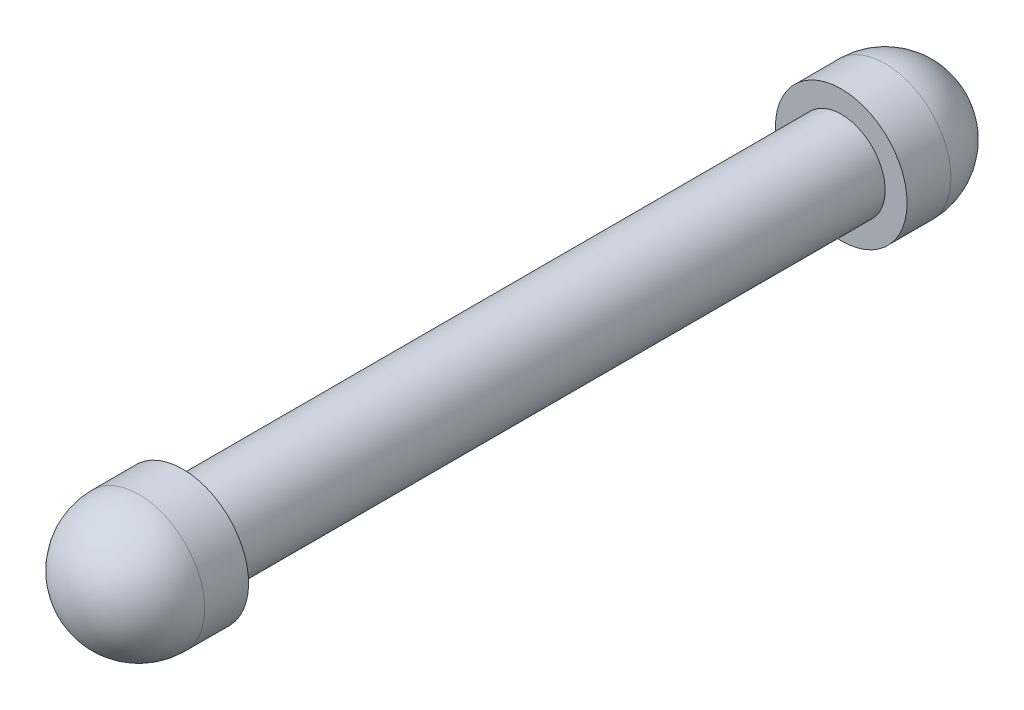
ISO-10303-21;
HEADER;
FILE_DESCRIPTION(('STEP AP214'),'2;1');
FILE_NAME('part.step','',(''),(''),'','','');
FILE_SCHEMA(('AUTOMOTIVE_DESIGN { 1 0 10303 214 1 1 1 1 }'));
ENDSEC;
DATA;
#1=APPLICATION_CONTEXT('core data for automotive mechanical design processes');
#2=APPLICATION_PROTOCOL_DEFINITION('international standard','automotive_design',2000,#1);
#3=PRODUCT_CONTEXT('',#1,'mechanical');
#4=PRODUCT('Part','Part','',(#3));
#5=PRODUCT_RELATED_PRODUCT_CATEGORY('part','',(#4));
#6=PRODUCT_DEFINITION_FORMATION('','',#4);
#7=PRODUCT_DEFINITION_CONTEXT('part definition',#1,'design');
#8=PRODUCT_DEFINITION('design','',#6,#7);
#9=PRODUCT_DEFINITION_SHAPE('','',#8);
#10=(LENGTH_UNIT() NAMED_UNIT(*) SI_UNIT(.MILLI.,.METRE.));
#11=(NAMED_UNIT(*) PLANE_ANGLE_UNIT() SI_UNIT($,.RADIAN.));
#12=(NAMED_UNIT(*) SI_UNIT($,.STERADIAN.) SOLID_ANGLE_UNIT());
#13=UNCERTAINTY_MEASURE_WITH_UNIT(LENGTH_MEASURE(1.E-05),#10,'distance_accuracy_value','');
#14=(GEOMETRIC_REPRESENTATION_CONTEXT(3) GLOBAL_UNCERTAINTY_ASSIGNED_CONTEXT((#13)) GLOBAL_UNIT_ASSIGNED_CONTEXT((#10,
#11,#12)) REPRESENTATION_CONTEXT('',''));
#15=CARTESIAN_POINT('',(0.,0.,0.));
#16=DIRECTION('',(0.,0.,1.));
#17=DIRECTION('',(1.,0.,0.));
#18=AXIS2_PLACEMENT_3D('',#15,#16,#17);
#19=CARTESIAN_POINT('',(0.,0.,14.999999972));
#20=DIRECTION('',(0.,0.,-1.));
#21=DIRECTION('',(0.,1.,0.));
#22=AXIS2_PLACEMENT_3D('',#19,#20,#21);
#23=CYLINDRICAL_SURFACE('',#22,2.);
#24=CARTESIAN_POINT('',(0.,0.,-14.999999972));
#25=DIRECTION('',(0.,0.,-1.));
#26=DIRECTION('',(0.,1.,0.));
#27=AXIS2_PLACEMENT_3D('',#24,#25,#26);
#28=CIRCLE('',#27,2.);
#29=CARTESIAN_POINT('',(0.,2.00000000000001,-14.999999972));
#30=VERTEX_POINT('',#29);
#31=EDGE_CURVE('E62',#30,#30,#28,.T.);
#32=ORIENTED_EDGE('',*,*,#31,.F.);
#33=EDGE_LOOP('',(#32));
#34=FACE_BOUND('',#33,.T.);
#35=CARTESIAN_POINT('',(0.,0.,14.999999972));
#36=DIRECTION('',(0.,0.,-1.));
#37=DIRECTION('',(0.,1.,0.));
#38=AXIS2_PLACEMENT_3D('',#35,#36,#37);
#39=CIRCLE('',#38,2.);
#40=CARTESIAN_POINT('',(0.,2.,14.999999972));
#41=VERTEX_POINT('',#40);
#42=EDGE_CURVE('E70',#41,#41,#39,.T.);
#43=ORIENTED_EDGE('',*,*,#42,.T.);
#44=EDGE_LOOP('',(#43));
#45=FACE_BOUND('',#44,.T.);
#46=ADVANCED_FACE('F49',(#34,#45),#23,.T.);
#47=CARTESIAN_POINT('',(0.,0.,-19.999999972));
#48=DIRECTION('',(0.,0.,1.));
#49=DIRECTION('',(0.,-1.,0.));
#50=AXIS2_PLACEMENT_3D('',#47,#48,#49);
#51=CYLINDRICAL_SURFACE('',#50,3.);
#52=CARTESIAN_POINT('',(0.,0.,-16.999999972));
#53=DIRECTION('',(0.,0.,1.));
#54=DIRECTION('',(0.,-1.,0.));
#55=AXIS2_PLACEMENT_3D('',#52,#53,#54);
#56=CIRCLE('',#55,3.);
#57=CARTESIAN_POINT('',(0.,-3.,-16.999999972));
#58=VERTEX_POINT('',#57);
#59=EDGE_CURVE('E57',#58,#58,#56,.T.);
#60=ORIENTED_EDGE('',*,*,#59,.T.);
#61=EDGE_LOOP('',(#60));
#62=FACE_BOUND('',#61,.T.);
#63=CARTESIAN_POINT('',(0.,0.,-14.999999972));
#64=DIRECTION('',(0.,0.,-1.));
#65=DIRECTION('',(0.,1.,0.));
#66=AXIS2_PLACEMENT_3D('',#63,#64,#65);
#67=CIRCLE('',#66,3.);
#68=CARTESIAN_POINT('',(0.,3.,-14.999999972));
#69=VERTEX_POINT('',#68);
#70=EDGE_CURVE('E67',#69,#69,#67,.T.);
#71=ORIENTED_EDGE('',*,*,#70,.T.);
#72=EDGE_LOOP('',(#71));
#73=FACE_BOUND('',#72,.T.);
#74=ADVANCED_FACE('F98',(#62,#73),#51,.T.);
#75=CARTESIAN_POINT('',(0.,0.,-14.999999972));
#76=DIRECTION('',(0.,0.,-1.));
#77=DIRECTION('',(0.,1.,0.));
#78=AXIS2_PLACEMENT_3D('',#75,#76,#77);
#79=PLANE('',#78);
#80=ORIENTED_EDGE('',*,*,#31,.T.);
#81=EDGE_LOOP('',(#80));
#82=FACE_BOUND('',#81,.T.);
#83=ORIENTED_EDGE('',*,*,#70,.F.);
#84=EDGE_LOOP('',(#83));
#85=FACE_BOUND('',#84,.T.);
#86=ADVANCED_FACE('F94',(#82,#85),#79,.F.);
#87=CARTESIAN_POINT('',(0.,0.,-16.999999972));
#88=DIRECTION('',(0.,0.,-1.));
#89=DIRECTION('',(0.,1.,0.));
#90=AXIS2_PLACEMENT_3D('',#87,#88,#89);
#91=SPHERICAL_SURFACE('',#90,3.);
#92=ORIENTED_EDGE('',*,*,#59,.F.);
#93=EDGE_LOOP('',(#92));
#94=FACE_BOUND('',#93,.T.);
#95=ADVANCED_FACE('F86',(#94),#91,.T.);
#96=CARTESIAN_POINT('',(0.,0.,19.999999972));
#97=DIRECTION('',(0.,0.,-1.));
#98=DIRECTION('',(0.,1.,0.));
#99=AXIS2_PLACEMENT_3D('',#96,#97,#98);
#100=CYLINDRICAL_SURFACE('',#99,3.);
#101=CARTESIAN_POINT('',(0.,0.,16.999999972));
#102=DIRECTION('',(0.,0.,-1.));
#103=DIRECTION('',(0.,1.,0.));
#104=AXIS2_PLACEMENT_3D('',#101,#102,#103);
#105=CIRCLE('',#104,3.);
#106=CARTESIAN_POINT('',(0.,3.,16.999999972));
#107=VERTEX_POINT('',#106);
#108=EDGE_CURVE('E11',#107,#107,#105,.T.);
#109=ORIENTED_EDGE('',*,*,#108,.T.);
#110=EDGE_LOOP('',(#109));
#111=FACE_BOUND('',#110,.T.);
#112=CARTESIAN_POINT('',(0.,0.,14.999999972));
#113=DIRECTION('',(0.,0.,-1.));
#114=DIRECTION('',(0.,1.,0.));
#115=AXIS2_PLACEMENT_3D('',#112,#113,#114);
#116=CIRCLE('',#115,3.);
#117=CARTESIAN_POINT('',(0.,3.,14.999999972));
#118=VERTEX_POINT('',#117);
#119=EDGE_CURVE('E74',#118,#118,#116,.T.);
#120=ORIENTED_EDGE('',*,*,#119,.F.);
#121=EDGE_LOOP('',(#120));
#122=FACE_BOUND('',#121,.T.);
#123=ADVANCED_FACE('F84',(#111,#122),#100,.T.);
#124=CARTESIAN_POINT('',(0.,0.,14.999999972));
#125=DIRECTION('',(0.,0.,1.));
#126=DIRECTION('',(0.,1.,0.));
#127=AXIS2_PLACEMENT_3D('',#124,#125,#126);
#128=PLANE('',#127);
#129=ORIENTED_EDGE('',*,*,#42,.F.);
#130=EDGE_LOOP('',(#129));
#131=FACE_BOUND('',#130,.T.);
#132=ORIENTED_EDGE('',*,*,#119,.T.);
#133=EDGE_LOOP('',(#132));
#134=FACE_BOUND('',#133,.T.);
#135=ADVANCED_FACE('F82',(#131,#134),#128,.F.);
#136=CARTESIAN_POINT('',(0.,0.,16.999999972));
#137=DIRECTION('',(0.,0.,1.));
#138=DIRECTION('',(0.,-1.,0.));
#139=AXIS2_PLACEMENT_3D('',#136,#137,#138);
#140=SPHERICAL_SURFACE('',#139,3.);
#141=ORIENTED_EDGE('',*,*,#108,.F.);
#142=EDGE_LOOP('',(#141));
#143=FACE_BOUND('',#142,.T.);
#144=ADVANCED_FACE('F51',(#143),#140,.T.);
#145=CLOSED_SHELL('',(#46,#74,#86,#95,#123,#135,#144));
#146=MANIFOLD_SOLID_BREP('B2',#145);
#147=ADVANCED_BREP_SHAPE_REPRESENTATION('',(#18,#146),#14);
#148=SHAPE_DEFINITION_REPRESENTATION(#9,#147);
ENDSEC;
END-ISO-10303-21;
